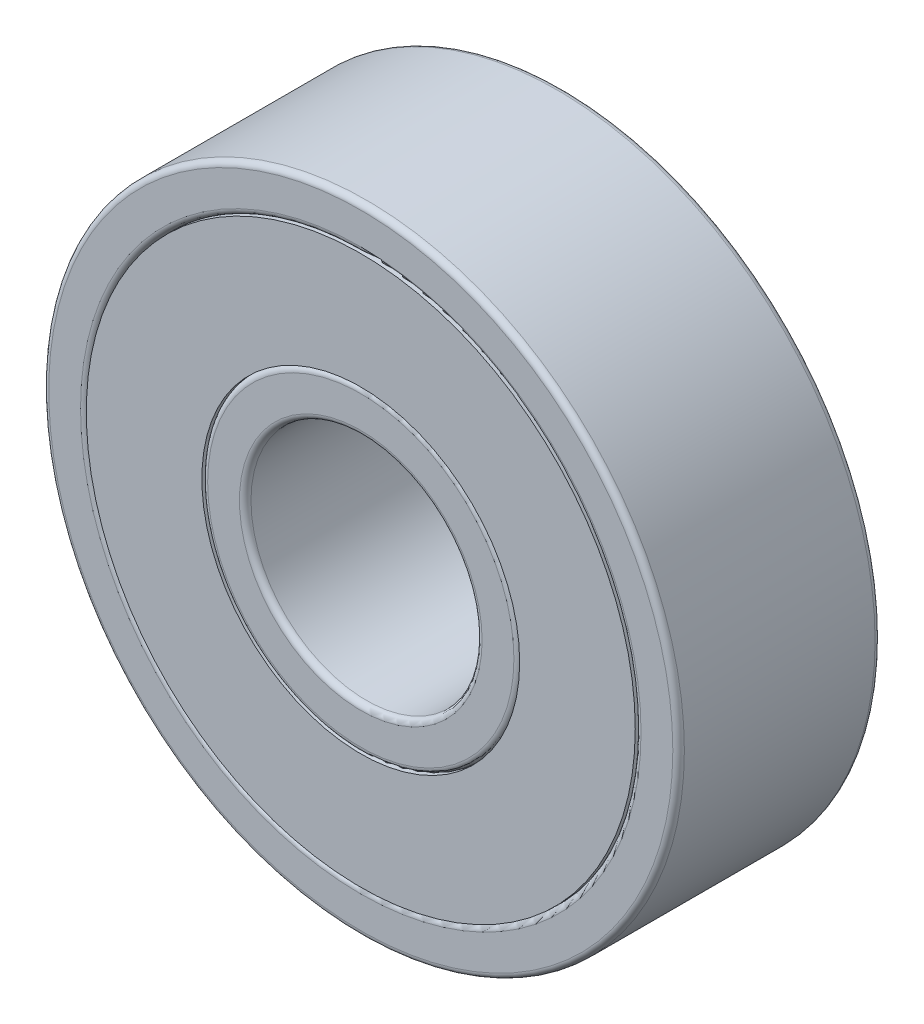
ISO-10303-21;
HEADER;
FILE_DESCRIPTION(('STEP AP214'),'2;1');
FILE_NAME('part.step','',(''),(''),'','','');
FILE_SCHEMA(('AUTOMOTIVE_DESIGN { 1 0 10303 214 1 1 1 1 }'));
ENDSEC;
DATA;
#1=APPLICATION_CONTEXT('core data for automotive mechanical design processes');
#2=APPLICATION_PROTOCOL_DEFINITION('international standard','automotive_design',2000,#1);
#3=PRODUCT_CONTEXT('',#1,'mechanical');
#4=PRODUCT('Part','Part','',(#3));
#5=PRODUCT_RELATED_PRODUCT_CATEGORY('part','',(#4));
#6=PRODUCT_DEFINITION_FORMATION('','',#4);
#7=PRODUCT_DEFINITION_CONTEXT('part definition',#1,'design');
#8=PRODUCT_DEFINITION('design','',#6,#7);
#9=PRODUCT_DEFINITION_SHAPE('','',#8);
#10=(LENGTH_UNIT() NAMED_UNIT(*) SI_UNIT(.MILLI.,.METRE.));
#11=(NAMED_UNIT(*) PLANE_ANGLE_UNIT() SI_UNIT($,.RADIAN.));
#12=(NAMED_UNIT(*) SI_UNIT($,.STERADIAN.) SOLID_ANGLE_UNIT());
#13=UNCERTAINTY_MEASURE_WITH_UNIT(LENGTH_MEASURE(1.E-05),#10,'distance_accuracy_value','');
#14=(GEOMETRIC_REPRESENTATION_CONTEXT(3) GLOBAL_UNCERTAINTY_ASSIGNED_CONTEXT((#13)) GLOBAL_UNIT_ASSIGNED_CONTEXT((#10,
#11,#12)) REPRESENTATION_CONTEXT('',''));
#15=CARTESIAN_POINT('',(0.,0.,0.));
#16=DIRECTION('',(0.,0.,1.));
#17=DIRECTION('',(1.,0.,0.));
#18=AXIS2_PLACEMENT_3D('',#15,#16,#17);
#19=CARTESIAN_POINT('',(0.,0.,7.));
#20=DIRECTION('',(0.,0.,-1.));
#21=DIRECTION('',(-1.,0.,0.));
#22=AXIS2_PLACEMENT_3D('',#19,#20,#21);
#23=CYLINDRICAL_SURFACE('',#22,5.5);
#24=CARTESIAN_POINT('',(0.,0.,7.));
#25=DIRECTION('',(0.,0.,1.));
#26=DIRECTION('',(1.,0.,0.));
#27=AXIS2_PLACEMENT_3D('',#24,#25,#26);
#28=CIRCLE('',#27,5.5);
#29=CARTESIAN_POINT('',(5.5,0.,7.));
#30=VERTEX_POINT('',#29);
#31=EDGE_CURVE('E54',#30,#30,#28,.T.);
#32=ORIENTED_EDGE('',*,*,#31,.T.);
#33=EDGE_LOOP('',(#32));
#34=FACE_BOUND('',#33,.T.);
#35=CARTESIAN_POINT('',(0.,0.,0.));
#36=DIRECTION('',(0.,0.,1.));
#37=DIRECTION('',(1.,0.,0.));
#38=AXIS2_PLACEMENT_3D('',#35,#36,#37);
#39=CIRCLE('',#38,5.5);
#40=CARTESIAN_POINT('',(5.5,0.,0.));
#41=VERTEX_POINT('',#40);
#42=EDGE_CURVE('E60',#41,#41,#39,.T.);
#43=ORIENTED_EDGE('',*,*,#42,.F.);
#44=EDGE_LOOP('',(#43));
#45=FACE_BOUND('',#44,.T.);
#46=ADVANCED_FACE('F47',(#34,#45),#23,.F.);
#47=CARTESIAN_POINT('',(0.,0.,7.));
#48=DIRECTION('',(0.,0.,-1.));
#49=DIRECTION('',(-1.,0.,0.));
#50=AXIS2_PLACEMENT_3D('',#47,#48,#49);
#51=CYLINDRICAL_SURFACE('',#50,9.5);
#52=CARTESIAN_POINT('',(0.,0.,7.));
#53=DIRECTION('',(0.,0.,1.));
#54=DIRECTION('',(1.,0.,0.));
#55=AXIS2_PLACEMENT_3D('',#52,#53,#54);
#56=CIRCLE('',#55,9.5);
#57=CARTESIAN_POINT('',(9.5,0.,7.));
#58=VERTEX_POINT('',#57);
#59=EDGE_CURVE('E12',#58,#58,#56,.T.);
#60=ORIENTED_EDGE('',*,*,#59,.F.);
#61=EDGE_LOOP('',(#60));
#62=FACE_BOUND('',#61,.T.);
#63=CARTESIAN_POINT('',(0.,0.,0.));
#64=DIRECTION('',(0.,0.,1.));
#65=DIRECTION('',(1.,0.,0.));
#66=AXIS2_PLACEMENT_3D('',#63,#64,#65);
#67=CIRCLE('',#66,9.5);
#68=CARTESIAN_POINT('',(9.5,0.,0.));
#69=VERTEX_POINT('',#68);
#70=EDGE_CURVE('E50',#69,#69,#67,.T.);
#71=ORIENTED_EDGE('',*,*,#70,.T.);
#72=EDGE_LOOP('',(#71));
#73=FACE_BOUND('',#72,.T.);
#74=ADVANCED_FACE('F67',(#62,#73),#51,.T.);
#75=CARTESIAN_POINT('',(0.,0.,7.));
#76=DIRECTION('',(0.,0.,1.));
#77=DIRECTION('',(1.,0.,0.));
#78=AXIS2_PLACEMENT_3D('',#75,#76,#77);
#79=PLANE('',#78);
#80=ORIENTED_EDGE('',*,*,#31,.F.);
#81=EDGE_LOOP('',(#80));
#82=FACE_BOUND('',#81,.T.);
#83=ORIENTED_EDGE('',*,*,#59,.T.);
#84=EDGE_LOOP('',(#83));
#85=FACE_BOUND('',#84,.T.);
#86=ADVANCED_FACE('F71',(#82,#85),#79,.T.);
#87=CARTESIAN_POINT('',(0.,0.,0.));
#88=DIRECTION('',(0.,0.,1.));
#89=DIRECTION('',(1.,0.,0.));
#90=AXIS2_PLACEMENT_3D('',#87,#88,#89);
#91=PLANE('',#90);
#92=ORIENTED_EDGE('',*,*,#42,.T.);
#93=EDGE_LOOP('',(#92));
#94=FACE_BOUND('',#93,.T.);
#95=ORIENTED_EDGE('',*,*,#70,.F.);
#96=EDGE_LOOP('',(#95));
#97=FACE_BOUND('',#96,.T.);
#98=ADVANCED_FACE('F69',(#94,#97),#91,.F.);
#99=CLOSED_SHELL('',(#46,#74,#86,#98));
#100=MANIFOLD_SOLID_BREP('B2',#99);
#101=CARTESIAN_POINT('',(0.,0.,7.));
#102=DIRECTION('',(0.,0.,-1.));
#103=DIRECTION('',(-1.,0.,0.));
#104=AXIS2_PLACEMENT_3D('',#101,#102,#103);
#105=CYLINDRICAL_SURFACE('',#104,4.);
#106=CARTESIAN_POINT('',(0.,0.,0.2));
#107=DIRECTION('',(0.,0.,1.));
#108=DIRECTION('',(1.,0.,0.));
#109=AXIS2_PLACEMENT_3D('',#106,#107,#108);
#110=CIRCLE('',#109,4.);
#111=CARTESIAN_POINT('',(4.,0.,0.2));
#112=VERTEX_POINT('',#111);
#113=EDGE_CURVE('E126',#112,#112,#110,.F.);
#114=ORIENTED_EDGE('',*,*,#113,.T.);
#115=EDGE_LOOP('',(#114));
#116=FACE_BOUND('',#115,.T.);
#117=CARTESIAN_POINT('',(0.,0.,6.8));
#118=DIRECTION('',(0.,0.,1.));
#119=DIRECTION('',(1.,0.,0.));
#120=AXIS2_PLACEMENT_3D('',#117,#118,#119);
#121=CIRCLE('',#120,4.);
#122=CARTESIAN_POINT('',(4.,0.,6.8));
#123=VERTEX_POINT('',#122);
#124=EDGE_CURVE('E130',#123,#123,#121,.T.);
#125=ORIENTED_EDGE('',*,*,#124,.T.);
#126=EDGE_LOOP('',(#125));
#127=FACE_BOUND('',#126,.T.);
#128=ADVANCED_FACE('F115',(#116,#127),#105,.F.);
#129=CARTESIAN_POINT('',(0.,0.,7.));
#130=DIRECTION('',(0.,0.,-1.));
#131=DIRECTION('',(-1.,0.,0.));
#132=AXIS2_PLACEMENT_3D('',#129,#130,#131);
#133=CYLINDRICAL_SURFACE('',#132,5.5);
#134=CARTESIAN_POINT('',(0.,0.,0.2));
#135=DIRECTION('',(0.,0.,1.));
#136=DIRECTION('',(1.,0.,0.));
#137=AXIS2_PLACEMENT_3D('',#134,#135,#136);
#138=CIRCLE('',#137,5.5);
#139=CARTESIAN_POINT('',(5.5,0.,0.2));
#140=VERTEX_POINT('',#139);
#141=EDGE_CURVE('E141',#140,#140,#138,.T.);
#142=ORIENTED_EDGE('',*,*,#141,.T.);
#143=EDGE_LOOP('',(#142));
#144=FACE_BOUND('',#143,.T.);
#145=CARTESIAN_POINT('',(0.,0.,6.8));
#146=DIRECTION('',(0.,0.,1.));
#147=DIRECTION('',(1.,0.,0.));
#148=AXIS2_PLACEMENT_3D('',#145,#146,#147);
#149=CIRCLE('',#148,5.5);
#150=CARTESIAN_POINT('',(5.5,0.,6.8));
#151=VERTEX_POINT('',#150);
#152=EDGE_CURVE('E144',#151,#151,#149,.F.);
#153=ORIENTED_EDGE('',*,*,#152,.T.);
#154=EDGE_LOOP('',(#153));
#155=FACE_BOUND('',#154,.T.);
#156=ADVANCED_FACE('F148',(#144,#155),#133,.T.);
#157=CARTESIAN_POINT('',(0.,0.,7.));
#158=DIRECTION('',(0.,0.,1.));
#159=DIRECTION('',(1.,0.,0.));
#160=AXIS2_PLACEMENT_3D('',#157,#158,#159);
#161=PLANE('',#160);
#162=CARTESIAN_POINT('',(0.,0.,7.));
#163=DIRECTION('',(0.,0.,1.));
#164=DIRECTION('',(1.,0.,0.));
#165=AXIS2_PLACEMENT_3D('',#162,#163,#164);
#166=CIRCLE('',#165,5.3);
#167=CARTESIAN_POINT('',(5.3,0.,7.));
#168=VERTEX_POINT('',#167);
#169=EDGE_CURVE('E46',#168,#168,#166,.T.);
#170=ORIENTED_EDGE('',*,*,#169,.T.);
#171=EDGE_LOOP('',(#170));
#172=FACE_BOUND('',#171,.T.);
#173=CARTESIAN_POINT('',(0.,0.,7.));
#174=DIRECTION('',(0.,0.,1.));
#175=DIRECTION('',(1.,0.,0.));
#176=AXIS2_PLACEMENT_3D('',#173,#174,#175);
#177=CIRCLE('',#176,4.2);
#178=CARTESIAN_POINT('',(4.2,0.,7.));
#179=VERTEX_POINT('',#178);
#180=EDGE_CURVE('E122',#179,#179,#177,.F.);
#181=ORIENTED_EDGE('',*,*,#180,.T.);
#182=EDGE_LOOP('',(#181));
#183=FACE_BOUND('',#182,.T.);
#184=ADVANCED_FACE('F168',(#172,#183),#161,.T.);
#185=CARTESIAN_POINT('',(0.,0.,0.));
#186=DIRECTION('',(0.,0.,1.));
#187=DIRECTION('',(1.,0.,0.));
#188=AXIS2_PLACEMENT_3D('',#185,#186,#187);
#189=PLANE('',#188);
#190=CARTESIAN_POINT('',(0.,0.,0.));
#191=DIRECTION('',(0.,0.,1.));
#192=DIRECTION('',(1.,0.,0.));
#193=AXIS2_PLACEMENT_3D('',#190,#191,#192);
#194=CIRCLE('',#193,5.3);
#195=CARTESIAN_POINT('',(5.3,0.,0.));
#196=VERTEX_POINT('',#195);
#197=EDGE_CURVE('E135',#196,#196,#194,.F.);
#198=ORIENTED_EDGE('',*,*,#197,.T.);
#199=EDGE_LOOP('',(#198));
#200=FACE_BOUND('',#199,.T.);
#201=CARTESIAN_POINT('',(0.,0.,0.));
#202=DIRECTION('',(0.,0.,1.));
#203=DIRECTION('',(1.,0.,0.));
#204=AXIS2_PLACEMENT_3D('',#201,#202,#203);
#205=CIRCLE('',#204,4.2);
#206=CARTESIAN_POINT('',(4.2,0.,0.));
#207=VERTEX_POINT('',#206);
#208=EDGE_CURVE('E138',#207,#207,#205,.T.);
#209=ORIENTED_EDGE('',*,*,#208,.T.);
#210=EDGE_LOOP('',(#209));
#211=FACE_BOUND('',#210,.T.);
#212=ADVANCED_FACE('F175',(#200,#211),#189,.F.);
#213=CARTESIAN_POINT('',(0.,0.,0.2));
#214=DIRECTION('',(0.,0.,1.));
#215=DIRECTION('',(1.,0.,0.));
#216=AXIS2_PLACEMENT_3D('',#213,#214,#215);
#217=TOROIDAL_SURFACE('',#216,5.3,0.2);
#218=ORIENTED_EDGE('',*,*,#197,.F.);
#219=EDGE_LOOP('',(#218));
#220=FACE_BOUND('',#219,.T.);
#221=ORIENTED_EDGE('',*,*,#141,.F.);
#222=EDGE_LOOP('',(#221));
#223=FACE_BOUND('',#222,.T.);
#224=ADVANCED_FACE('F159',(#220,#223),#217,.T.);
#225=CARTESIAN_POINT('',(0.,0.,0.2));
#226=DIRECTION('',(0.,0.,1.));
#227=DIRECTION('',(1.,0.,0.));
#228=AXIS2_PLACEMENT_3D('',#225,#226,#227);
#229=TOROIDAL_SURFACE('',#228,4.2,0.2);
#230=ORIENTED_EDGE('',*,*,#113,.F.);
#231=EDGE_LOOP('',(#230));
#232=FACE_BOUND('',#231,.T.);
#233=ORIENTED_EDGE('',*,*,#208,.F.);
#234=EDGE_LOOP('',(#233));
#235=FACE_BOUND('',#234,.T.);
#236=ADVANCED_FACE('F153',(#232,#235),#229,.T.);
#237=CARTESIAN_POINT('',(0.,0.,6.8));
#238=DIRECTION('',(0.,0.,1.));
#239=DIRECTION('',(1.,0.,0.));
#240=AXIS2_PLACEMENT_3D('',#237,#238,#239);
#241=TOROIDAL_SURFACE('',#240,5.3,0.2);
#242=ORIENTED_EDGE('',*,*,#152,.F.);
#243=EDGE_LOOP('',(#242));
#244=FACE_BOUND('',#243,.T.);
#245=ORIENTED_EDGE('',*,*,#169,.F.);
#246=EDGE_LOOP('',(#245));
#247=FACE_BOUND('',#246,.T.);
#248=ADVANCED_FACE('F150',(#244,#247),#241,.T.);
#249=CARTESIAN_POINT('',(0.,0.,6.8));
#250=DIRECTION('',(0.,0.,1.));
#251=DIRECTION('',(1.,0.,0.));
#252=AXIS2_PLACEMENT_3D('',#249,#250,#251);
#253=TOROIDAL_SURFACE('',#252,4.2,0.2);
#254=ORIENTED_EDGE('',*,*,#180,.F.);
#255=EDGE_LOOP('',(#254));
#256=FACE_BOUND('',#255,.T.);
#257=ORIENTED_EDGE('',*,*,#124,.F.);
#258=EDGE_LOOP('',(#257));
#259=FACE_BOUND('',#258,.T.);
#260=ADVANCED_FACE('F117',(#256,#259),#253,.T.);
#261=CLOSED_SHELL('',(#128,#156,#184,#212,#224,#236,#248,#260));
#262=MANIFOLD_SOLID_BREP('B7',#261);
#263=CARTESIAN_POINT('',(0.,0.,7.));
#264=DIRECTION('',(0.,0.,-1.));
#265=DIRECTION('',(-1.,0.,0.));
#266=AXIS2_PLACEMENT_3D('',#263,#264,#265);
#267=CYLINDRICAL_SURFACE('',#266,9.5);
#268=CARTESIAN_POINT('',(0.,0.,0.2));
#269=DIRECTION('',(0.,0.,1.));
#270=DIRECTION('',(1.,0.,0.));
#271=AXIS2_PLACEMENT_3D('',#268,#269,#270);
#272=CIRCLE('',#271,9.5);
#273=CARTESIAN_POINT('',(9.5,0.,0.2));
#274=VERTEX_POINT('',#273);
#275=EDGE_CURVE('E247',#274,#274,#272,.F.);
#276=ORIENTED_EDGE('',*,*,#275,.T.);
#277=EDGE_LOOP('',(#276));
#278=FACE_BOUND('',#277,.T.);
#279=CARTESIAN_POINT('',(0.,0.,6.8));
#280=DIRECTION('',(0.,0.,1.));
#281=DIRECTION('',(1.,0.,0.));
#282=AXIS2_PLACEMENT_3D('',#279,#280,#281);
#283=CIRCLE('',#282,9.5);
#284=CARTESIAN_POINT('',(9.5,0.,6.8));
#285=VERTEX_POINT('',#284);
#286=EDGE_CURVE('E251',#285,#285,#283,.T.);
#287=ORIENTED_EDGE('',*,*,#286,.T.);
#288=EDGE_LOOP('',(#287));
#289=FACE_BOUND('',#288,.T.);
#290=ADVANCED_FACE('F236',(#278,#289),#267,.F.);
#291=CARTESIAN_POINT('',(0.,0.,7.));
#292=DIRECTION('',(0.,0.,-1.));
#293=DIRECTION('',(-1.,0.,0.));
#294=AXIS2_PLACEMENT_3D('',#291,#292,#293);
#295=CYLINDRICAL_SURFACE('',#294,11.);
#296=CARTESIAN_POINT('',(0.,0.,0.2));
#297=DIRECTION('',(0.,0.,1.));
#298=DIRECTION('',(1.,0.,0.));
#299=AXIS2_PLACEMENT_3D('',#296,#297,#298);
#300=CIRCLE('',#299,11.);
#301=CARTESIAN_POINT('',(11.,0.,0.2));
#302=VERTEX_POINT('',#301);
#303=EDGE_CURVE('E262',#302,#302,#300,.T.);
#304=ORIENTED_EDGE('',*,*,#303,.T.);
#305=EDGE_LOOP('',(#304));
#306=FACE_BOUND('',#305,.T.);
#307=CARTESIAN_POINT('',(0.,0.,6.8));
#308=DIRECTION('',(0.,0.,1.));
#309=DIRECTION('',(1.,0.,0.));
#310=AXIS2_PLACEMENT_3D('',#307,#308,#309);
#311=CIRCLE('',#310,11.);
#312=CARTESIAN_POINT('',(11.,0.,6.8));
#313=VERTEX_POINT('',#312);
#314=EDGE_CURVE('E265',#313,#313,#311,.F.);
#315=ORIENTED_EDGE('',*,*,#314,.T.);
#316=EDGE_LOOP('',(#315));
#317=FACE_BOUND('',#316,.T.);
#318=ADVANCED_FACE('F269',(#306,#317),#295,.T.);
#319=CARTESIAN_POINT('',(0.,0.,7.));
#320=DIRECTION('',(0.,0.,1.));
#321=DIRECTION('',(1.,0.,0.));
#322=AXIS2_PLACEMENT_3D('',#319,#320,#321);
#323=PLANE('',#322);
#324=CARTESIAN_POINT('',(0.,0.,7.));
#325=DIRECTION('',(0.,0.,1.));
#326=DIRECTION('',(1.,0.,0.));
#327=AXIS2_PLACEMENT_3D('',#324,#325,#326);
#328=CIRCLE('',#327,10.8);
#329=CARTESIAN_POINT('',(10.8,0.,7.));
#330=VERTEX_POINT('',#329);
#331=EDGE_CURVE('E114',#330,#330,#328,.T.);
#332=ORIENTED_EDGE('',*,*,#331,.T.);
#333=EDGE_LOOP('',(#332));
#334=FACE_BOUND('',#333,.T.);
#335=CARTESIAN_POINT('',(0.,0.,7.));
#336=DIRECTION('',(0.,0.,1.));
#337=DIRECTION('',(1.,0.,0.));
#338=AXIS2_PLACEMENT_3D('',#335,#336,#337);
#339=CIRCLE('',#338,9.7);
#340=CARTESIAN_POINT('',(9.7,0.,7.));
#341=VERTEX_POINT('',#340);
#342=EDGE_CURVE('E243',#341,#341,#339,.F.);
#343=ORIENTED_EDGE('',*,*,#342,.T.);
#344=EDGE_LOOP('',(#343));
#345=FACE_BOUND('',#344,.T.);
#346=ADVANCED_FACE('F289',(#334,#345),#323,.T.);
#347=CARTESIAN_POINT('',(0.,0.,0.));
#348=DIRECTION('',(0.,0.,1.));
#349=DIRECTION('',(1.,0.,0.));
#350=AXIS2_PLACEMENT_3D('',#347,#348,#349);
#351=PLANE('',#350);
#352=CARTESIAN_POINT('',(0.,0.,0.));
#353=DIRECTION('',(0.,0.,1.));
#354=DIRECTION('',(1.,0.,0.));
#355=AXIS2_PLACEMENT_3D('',#352,#353,#354);
#356=CIRCLE('',#355,10.8);
#357=CARTESIAN_POINT('',(10.8,0.,0.));
#358=VERTEX_POINT('',#357);
#359=EDGE_CURVE('E256',#358,#358,#356,.F.);
#360=ORIENTED_EDGE('',*,*,#359,.T.);
#361=EDGE_LOOP('',(#360));
#362=FACE_BOUND('',#361,.T.);
#363=CARTESIAN_POINT('',(0.,0.,0.));
#364=DIRECTION('',(0.,0.,1.));
#365=DIRECTION('',(1.,0.,0.));
#366=AXIS2_PLACEMENT_3D('',#363,#364,#365);
#367=CIRCLE('',#366,9.7);
#368=CARTESIAN_POINT('',(9.7,0.,0.));
#369=VERTEX_POINT('',#368);
#370=EDGE_CURVE('E259',#369,#369,#367,.T.);
#371=ORIENTED_EDGE('',*,*,#370,.T.);
#372=EDGE_LOOP('',(#371));
#373=FACE_BOUND('',#372,.T.);
#374=ADVANCED_FACE('F296',(#362,#373),#351,.F.);
#375=CARTESIAN_POINT('',(0.,0.,0.2));
#376=DIRECTION('',(0.,0.,1.));
#377=DIRECTION('',(1.,0.,0.));
#378=AXIS2_PLACEMENT_3D('',#375,#376,#377);
#379=TOROIDAL_SURFACE('',#378,10.8,0.2);
#380=ORIENTED_EDGE('',*,*,#359,.F.);
#381=EDGE_LOOP('',(#380));
#382=FACE_BOUND('',#381,.T.);
#383=ORIENTED_EDGE('',*,*,#303,.F.);
#384=EDGE_LOOP('',(#383));
#385=FACE_BOUND('',#384,.T.);
#386=ADVANCED_FACE('F280',(#382,#385),#379,.T.);
#387=CARTESIAN_POINT('',(0.,0.,0.2));
#388=DIRECTION('',(0.,0.,1.));
#389=DIRECTION('',(1.,0.,0.));
#390=AXIS2_PLACEMENT_3D('',#387,#388,#389);
#391=TOROIDAL_SURFACE('',#390,9.7,0.2);
#392=ORIENTED_EDGE('',*,*,#275,.F.);
#393=EDGE_LOOP('',(#392));
#394=FACE_BOUND('',#393,.T.);
#395=ORIENTED_EDGE('',*,*,#370,.F.);
#396=EDGE_LOOP('',(#395));
#397=FACE_BOUND('',#396,.T.);
#398=ADVANCED_FACE('F274',(#394,#397),#391,.T.);
#399=CARTESIAN_POINT('',(0.,0.,6.8));
#400=DIRECTION('',(0.,0.,1.));
#401=DIRECTION('',(1.,0.,0.));
#402=AXIS2_PLACEMENT_3D('',#399,#400,#401);
#403=TOROIDAL_SURFACE('',#402,10.8,0.2);
#404=ORIENTED_EDGE('',*,*,#314,.F.);
#405=EDGE_LOOP('',(#404));
#406=FACE_BOUND('',#405,.T.);
#407=ORIENTED_EDGE('',*,*,#331,.F.);
#408=EDGE_LOOP('',(#407));
#409=FACE_BOUND('',#408,.T.);
#410=ADVANCED_FACE('F271',(#406,#409),#403,.T.);
#411=CARTESIAN_POINT('',(0.,0.,6.8));
#412=DIRECTION('',(0.,0.,1.));
#413=DIRECTION('',(1.,0.,0.));
#414=AXIS2_PLACEMENT_3D('',#411,#412,#413);
#415=TOROIDAL_SURFACE('',#414,9.7,0.2);
#416=ORIENTED_EDGE('',*,*,#342,.F.);
#417=EDGE_LOOP('',(#416));
#418=FACE_BOUND('',#417,.T.);
#419=ORIENTED_EDGE('',*,*,#286,.F.);
#420=EDGE_LOOP('',(#419));
#421=FACE_BOUND('',#420,.T.);
#422=ADVANCED_FACE('F238',(#418,#421),#415,.T.);
#423=CLOSED_SHELL('',(#290,#318,#346,#374,#386,#398,#410,#422));
#424=MANIFOLD_SOLID_BREP('B41',#423);
#425=ADVANCED_BREP_SHAPE_REPRESENTATION('',(#18,#100,#262,#424),#14);
#426=SHAPE_DEFINITION_REPRESENTATION(#9,#425);
ENDSEC;
END-ISO-10303-21;
